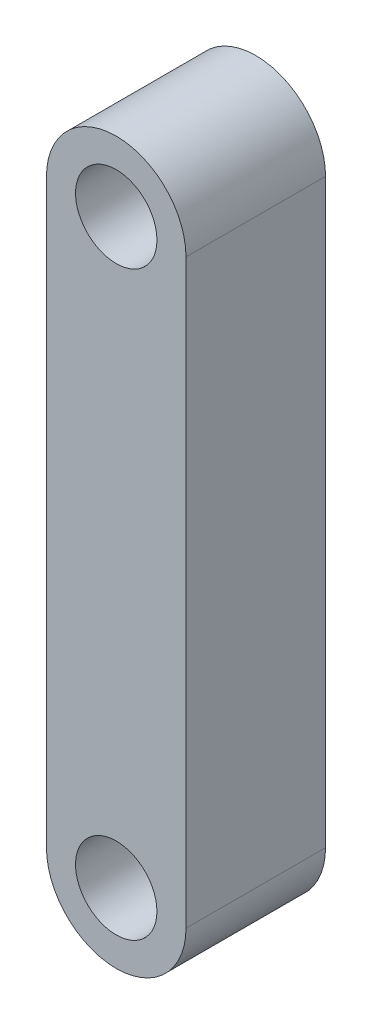
ISO-10303-21;
HEADER;
FILE_DESCRIPTION(('STEP AP214'),'2;1');
FILE_NAME('part.step','',(''),(''),'','','');
FILE_SCHEMA(('AUTOMOTIVE_DESIGN { 1 0 10303 214 1 1 1 1 }'));
ENDSEC;
DATA;
#1=APPLICATION_CONTEXT('core data for automotive mechanical design processes');
#2=APPLICATION_PROTOCOL_DEFINITION('international standard','automotive_design',2000,#1);
#3=PRODUCT_CONTEXT('',#1,'mechanical');
#4=PRODUCT('Part','Part','',(#3));
#5=PRODUCT_RELATED_PRODUCT_CATEGORY('part','',(#4));
#6=PRODUCT_DEFINITION_FORMATION('','',#4);
#7=PRODUCT_DEFINITION_CONTEXT('part definition',#1,'design');
#8=PRODUCT_DEFINITION('design','',#6,#7);
#9=PRODUCT_DEFINITION_SHAPE('','',#8);
#10=(LENGTH_UNIT() NAMED_UNIT(*) SI_UNIT(.MILLI.,.METRE.));
#11=(NAMED_UNIT(*) PLANE_ANGLE_UNIT() SI_UNIT($,.RADIAN.));
#12=(NAMED_UNIT(*) SI_UNIT($,.STERADIAN.) SOLID_ANGLE_UNIT());
#13=UNCERTAINTY_MEASURE_WITH_UNIT(LENGTH_MEASURE(1.E-05),#10,'distance_accuracy_value','');
#14=(GEOMETRIC_REPRESENTATION_CONTEXT(3) GLOBAL_UNCERTAINTY_ASSIGNED_CONTEXT((#13)) GLOBAL_UNIT_ASSIGNED_CONTEXT((#10,
#11,#12)) REPRESENTATION_CONTEXT('',''));
#15=CARTESIAN_POINT('',(0.,0.,0.));
#16=DIRECTION('',(0.,0.,1.));
#17=DIRECTION('',(1.,0.,0.));
#18=AXIS2_PLACEMENT_3D('',#15,#16,#17);
#19=CARTESIAN_POINT('',(0.,0.,-12.));
#20=DIRECTION('',(0.,0.,1.));
#21=DIRECTION('',(1.,0.,0.));
#22=AXIS2_PLACEMENT_3D('',#19,#20,#21);
#23=CYLINDRICAL_SURFACE('',#22,6.);
#24=CARTESIAN_POINT('',(0.,0.,0.));
#25=DIRECTION('',(0.,0.,1.));
#26=DIRECTION('',(1.,0.,0.));
#27=AXIS2_PLACEMENT_3D('',#24,#25,#26);
#28=CIRCLE('',#27,6.);
#29=CARTESIAN_POINT('',(6.,0.,0.));
#30=VERTEX_POINT('',#29);
#31=CARTESIAN_POINT('',(-6.,0.,0.));
#32=VERTEX_POINT('',#31);
#33=EDGE_CURVE('E121',#30,#32,#28,.T.);
#34=ORIENTED_EDGE('',*,*,#33,.F.);
#35=DIRECTION('',(0.,0.,1.));
#36=VECTOR('',#35,1.);
#37=CARTESIAN_POINT('',(6.,0.,-12.));
#38=LINE('',#37,#36);
#39=CARTESIAN_POINT('',(6.,0.,-12.));
#40=VERTEX_POINT('',#39);
#41=EDGE_CURVE('E11',#40,#30,#38,.T.);
#42=ORIENTED_EDGE('',*,*,#41,.F.);
#43=CARTESIAN_POINT('',(0.,0.,-12.));
#44=DIRECTION('',(0.,0.,1.));
#45=DIRECTION('',(1.,0.,0.));
#46=AXIS2_PLACEMENT_3D('',#43,#44,#45);
#47=CIRCLE('',#46,6.);
#48=CARTESIAN_POINT('',(-6.,0.,-12.));
#49=VERTEX_POINT('',#48);
#50=EDGE_CURVE('E111',#40,#49,#47,.T.);
#51=ORIENTED_EDGE('',*,*,#50,.T.);
#52=DIRECTION('',(0.,0.,1.));
#53=VECTOR('',#52,1.);
#54=CARTESIAN_POINT('',(-6.,0.,-12.));
#55=LINE('',#54,#53);
#56=EDGE_CURVE('E52',#49,#32,#55,.T.);
#57=ORIENTED_EDGE('',*,*,#56,.T.);
#58=EDGE_LOOP('',(#34,#42,#51,#57));
#59=FACE_BOUND('',#58,.T.);
#60=ADVANCED_FACE('F49',(#59),#23,.T.);
#61=CARTESIAN_POINT('',(6.,0.,-12.));
#62=DIRECTION('',(1.,0.,0.));
#63=DIRECTION('',(0.,1.,0.));
#64=AXIS2_PLACEMENT_3D('',#61,#62,#63);
#65=PLANE('',#64);
#66=DIRECTION('',(0.,1.,0.));
#67=VECTOR('',#66,1.);
#68=CARTESIAN_POINT('',(6.,0.,0.));
#69=LINE('',#68,#67);
#70=CARTESIAN_POINT('',(6.00000000000001,-50.,0.));
#71=VERTEX_POINT('',#70);
#72=EDGE_CURVE('E115',#71,#30,#69,.T.);
#73=ORIENTED_EDGE('',*,*,#72,.F.);
#74=DIRECTION('',(0.,0.,1.));
#75=VECTOR('',#74,1.);
#76=CARTESIAN_POINT('',(6.00000000000001,-50.,-12.));
#77=LINE('',#76,#75);
#78=CARTESIAN_POINT('',(6.00000000000001,-50.,-12.));
#79=VERTEX_POINT('',#78);
#80=EDGE_CURVE('E59',#79,#71,#77,.T.);
#81=ORIENTED_EDGE('',*,*,#80,.F.);
#82=DIRECTION('',(0.,1.,0.));
#83=VECTOR('',#82,1.);
#84=CARTESIAN_POINT('',(6.,0.,-12.));
#85=LINE('',#84,#83);
#86=EDGE_CURVE('E106',#79,#40,#85,.T.);
#87=ORIENTED_EDGE('',*,*,#86,.T.);
#88=ORIENTED_EDGE('',*,*,#41,.T.);
#89=EDGE_LOOP('',(#73,#81,#87,#88));
#90=FACE_BOUND('',#89,.T.);
#91=ADVANCED_FACE('F144',(#90),#65,.T.);
#92=CARTESIAN_POINT('',(0.,-50.,-12.));
#93=DIRECTION('',(0.,0.,1.));
#94=DIRECTION('',(1.,0.,0.));
#95=AXIS2_PLACEMENT_3D('',#92,#93,#94);
#96=CYLINDRICAL_SURFACE('',#95,6.);
#97=CARTESIAN_POINT('',(0.,-50.,0.));
#98=DIRECTION('',(0.,0.,1.));
#99=DIRECTION('',(1.,0.,0.));
#100=AXIS2_PLACEMENT_3D('',#97,#98,#99);
#101=CIRCLE('',#100,6.);
#102=CARTESIAN_POINT('',(-5.99999999999999,-50.,0.));
#103=VERTEX_POINT('',#102);
#104=EDGE_CURVE('E100',#103,#71,#101,.T.);
#105=ORIENTED_EDGE('',*,*,#104,.F.);
#106=DIRECTION('',(0.,0.,1.));
#107=VECTOR('',#106,1.);
#108=CARTESIAN_POINT('',(-5.99999999999999,-50.,-12.));
#109=LINE('',#108,#107);
#110=CARTESIAN_POINT('',(-5.99999999999999,-50.,-12.));
#111=VERTEX_POINT('',#110);
#112=EDGE_CURVE('E95',#111,#103,#109,.T.);
#113=ORIENTED_EDGE('',*,*,#112,.F.);
#114=CARTESIAN_POINT('',(0.,-50.,-12.));
#115=DIRECTION('',(0.,0.,1.));
#116=DIRECTION('',(1.,0.,0.));
#117=AXIS2_PLACEMENT_3D('',#114,#115,#116);
#118=CIRCLE('',#117,6.);
#119=EDGE_CURVE('E98',#111,#79,#118,.T.);
#120=ORIENTED_EDGE('',*,*,#119,.T.);
#121=ORIENTED_EDGE('',*,*,#80,.T.);
#122=EDGE_LOOP('',(#105,#113,#120,#121));
#123=FACE_BOUND('',#122,.T.);
#124=ADVANCED_FACE('F97',(#123),#96,.T.);
#125=CARTESIAN_POINT('',(-6.,0.,-12.));
#126=DIRECTION('',(-1.,0.,0.));
#127=DIRECTION('',(0.,-1.,0.));
#128=AXIS2_PLACEMENT_3D('',#125,#126,#127);
#129=PLANE('',#128);
#130=DIRECTION('',(0.,-1.,0.));
#131=VECTOR('',#130,1.);
#132=CARTESIAN_POINT('',(-6.,0.,0.));
#133=LINE('',#132,#131);
#134=EDGE_CURVE('E125',#32,#103,#133,.T.);
#135=ORIENTED_EDGE('',*,*,#134,.F.);
#136=ORIENTED_EDGE('',*,*,#56,.F.);
#137=DIRECTION('',(0.,-1.,0.));
#138=VECTOR('',#137,1.);
#139=CARTESIAN_POINT('',(-6.,0.,-12.));
#140=LINE('',#139,#138);
#141=EDGE_CURVE('E105',#49,#111,#140,.T.);
#142=ORIENTED_EDGE('',*,*,#141,.T.);
#143=ORIENTED_EDGE('',*,*,#112,.T.);
#144=EDGE_LOOP('',(#135,#136,#142,#143));
#145=FACE_BOUND('',#144,.T.);
#146=ADVANCED_FACE('F109',(#145),#129,.T.);
#147=CARTESIAN_POINT('',(0.,0.,-12.));
#148=DIRECTION('',(0.,0.,1.));
#149=DIRECTION('',(1.,0.,0.));
#150=AXIS2_PLACEMENT_3D('',#147,#148,#149);
#151=PLANE('',#150);
#152=CARTESIAN_POINT('',(0.,-50.,-12.));
#153=DIRECTION('',(0.,0.,1.));
#154=DIRECTION('',(1.,0.,0.));
#155=AXIS2_PLACEMENT_3D('',#152,#153,#154);
#156=CIRCLE('',#155,3.5);
#157=CARTESIAN_POINT('',(3.50000000000001,-50.,-12.));
#158=VERTEX_POINT('',#157);
#159=EDGE_CURVE('E178',#158,#158,#156,.T.);
#160=ORIENTED_EDGE('',*,*,#159,.T.);
#161=EDGE_LOOP('',(#160));
#162=FACE_BOUND('',#161,.T.);
#163=CARTESIAN_POINT('',(0.,0.,-12.));
#164=DIRECTION('',(0.,0.,1.));
#165=DIRECTION('',(1.,0.,0.));
#166=AXIS2_PLACEMENT_3D('',#163,#164,#165);
#167=CIRCLE('',#166,3.5);
#168=CARTESIAN_POINT('',(3.5,0.,-12.));
#169=VERTEX_POINT('',#168);
#170=EDGE_CURVE('E126',#169,#169,#167,.T.);
#171=ORIENTED_EDGE('',*,*,#170,.T.);
#172=EDGE_LOOP('',(#171));
#173=FACE_BOUND('',#172,.T.);
#174=ORIENTED_EDGE('',*,*,#50,.F.);
#175=ORIENTED_EDGE('',*,*,#86,.F.);
#176=ORIENTED_EDGE('',*,*,#119,.F.);
#177=ORIENTED_EDGE('',*,*,#141,.F.);
#178=EDGE_LOOP('',(#174,#175,#176,#177));
#179=FACE_BOUND('',#178,.T.);
#180=ADVANCED_FACE('F104',(#162,#173,#179),#151,.F.);
#181=CARTESIAN_POINT('',(0.,0.,0.));
#182=DIRECTION('',(0.,0.,1.));
#183=DIRECTION('',(1.,0.,0.));
#184=AXIS2_PLACEMENT_3D('',#181,#182,#183);
#185=PLANE('',#184);
#186=CARTESIAN_POINT('',(0.,-50.,0.));
#187=DIRECTION('',(0.,0.,1.));
#188=DIRECTION('',(1.,0.,0.));
#189=AXIS2_PLACEMENT_3D('',#186,#187,#188);
#190=CIRCLE('',#189,3.5);
#191=CARTESIAN_POINT('',(3.50000000000001,-50.,0.));
#192=VERTEX_POINT('',#191);
#193=EDGE_CURVE('E181',#192,#192,#190,.T.);
#194=ORIENTED_EDGE('',*,*,#193,.F.);
#195=EDGE_LOOP('',(#194));
#196=FACE_BOUND('',#195,.T.);
#197=CARTESIAN_POINT('',(0.,0.,0.));
#198=DIRECTION('',(0.,0.,1.));
#199=DIRECTION('',(1.,0.,0.));
#200=AXIS2_PLACEMENT_3D('',#197,#198,#199);
#201=CIRCLE('',#200,3.5);
#202=CARTESIAN_POINT('',(3.5,0.,0.));
#203=VERTEX_POINT('',#202);
#204=EDGE_CURVE('E186',#203,#203,#201,.T.);
#205=ORIENTED_EDGE('',*,*,#204,.F.);
#206=EDGE_LOOP('',(#205));
#207=FACE_BOUND('',#206,.T.);
#208=ORIENTED_EDGE('',*,*,#33,.T.);
#209=ORIENTED_EDGE('',*,*,#134,.T.);
#210=ORIENTED_EDGE('',*,*,#104,.T.);
#211=ORIENTED_EDGE('',*,*,#72,.T.);
#212=EDGE_LOOP('',(#208,#209,#210,#211));
#213=FACE_BOUND('',#212,.T.);
#214=ADVANCED_FACE('F143',(#196,#207,#213),#185,.T.);
#215=CARTESIAN_POINT('',(0.,0.,-12.));
#216=DIRECTION('',(0.,0.,1.));
#217=DIRECTION('',(1.,0.,0.));
#218=AXIS2_PLACEMENT_3D('',#215,#216,#217);
#219=CYLINDRICAL_SURFACE('',#218,3.5);
#220=ORIENTED_EDGE('',*,*,#170,.F.);
#221=EDGE_LOOP('',(#220));
#222=FACE_BOUND('',#221,.T.);
#223=ORIENTED_EDGE('',*,*,#204,.T.);
#224=EDGE_LOOP('',(#223));
#225=FACE_BOUND('',#224,.T.);
#226=ADVANCED_FACE('F163',(#222,#225),#219,.F.);
#227=CARTESIAN_POINT('',(0.,-50.,-12.));
#228=DIRECTION('',(0.,0.,1.));
#229=DIRECTION('',(1.,0.,0.));
#230=AXIS2_PLACEMENT_3D('',#227,#228,#229);
#231=CYLINDRICAL_SURFACE('',#230,3.5);
#232=ORIENTED_EDGE('',*,*,#159,.F.);
#233=EDGE_LOOP('',(#232));
#234=FACE_BOUND('',#233,.T.);
#235=ORIENTED_EDGE('',*,*,#193,.T.);
#236=EDGE_LOOP('',(#235));
#237=FACE_BOUND('',#236,.T.);
#238=ADVANCED_FACE('F170',(#234,#237),#231,.F.);
#239=CLOSED_SHELL('',(#60,#91,#124,#146,#180,#214,#226,#238));
#240=MANIFOLD_SOLID_BREP('B2',#239);
#241=ADVANCED_BREP_SHAPE_REPRESENTATION('',(#18,#240),#14);
#242=SHAPE_DEFINITION_REPRESENTATION(#9,#241);
ENDSEC;
END-ISO-10303-21;
